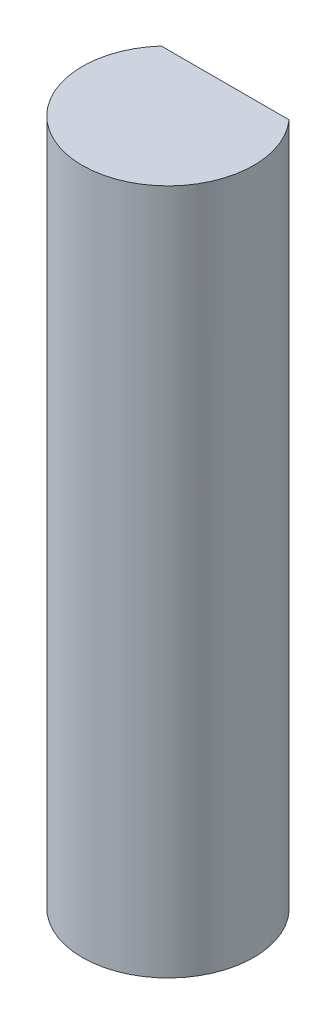
ISO-10303-21;
HEADER;
FILE_DESCRIPTION(('STEP AP214'),'2;1');
FILE_NAME('part.step','',(''),(''),'','','');
FILE_SCHEMA(('AUTOMOTIVE_DESIGN { 1 0 10303 214 1 1 1 1 }'));
ENDSEC;
DATA;
#1=APPLICATION_CONTEXT('core data for automotive mechanical design processes');
#2=APPLICATION_PROTOCOL_DEFINITION('international standard','automotive_design',2000,#1);
#3=PRODUCT_CONTEXT('',#1,'mechanical');
#4=PRODUCT('Part','Part','',(#3));
#5=PRODUCT_RELATED_PRODUCT_CATEGORY('part','',(#4));
#6=PRODUCT_DEFINITION_FORMATION('','',#4);
#7=PRODUCT_DEFINITION_CONTEXT('part definition',#1,'design');
#8=PRODUCT_DEFINITION('design','',#6,#7);
#9=PRODUCT_DEFINITION_SHAPE('','',#8);
#10=(LENGTH_UNIT() NAMED_UNIT(*) SI_UNIT(.MILLI.,.METRE.));
#11=(NAMED_UNIT(*) PLANE_ANGLE_UNIT() SI_UNIT($,.RADIAN.));
#12=(NAMED_UNIT(*) SI_UNIT($,.STERADIAN.) SOLID_ANGLE_UNIT());
#13=UNCERTAINTY_MEASURE_WITH_UNIT(LENGTH_MEASURE(1.E-05),#10,'distance_accuracy_value','');
#14=(GEOMETRIC_REPRESENTATION_CONTEXT(3) GLOBAL_UNCERTAINTY_ASSIGNED_CONTEXT((#13)) GLOBAL_UNIT_ASSIGNED_CONTEXT((#10,
#11,#12)) REPRESENTATION_CONTEXT('',''));
#15=CARTESIAN_POINT('',(0.,0.,0.));
#16=DIRECTION('',(0.,0.,1.));
#17=DIRECTION('',(1.,0.,0.));
#18=AXIS2_PLACEMENT_3D('',#15,#16,#17);
#19=CARTESIAN_POINT('',(0.,10.,0.));
#20=DIRECTION('',(0.,-1.,0.));
#21=DIRECTION('',(0.,0.,-1.));
#22=AXIS2_PLACEMENT_3D('',#19,#20,#21);
#23=CYLINDRICAL_SURFACE('',#22,1.5);
#24=CARTESIAN_POINT('',(0.,10.,0.));
#25=DIRECTION('',(0.,1.,0.));
#26=DIRECTION('',(0.,0.,1.));
#27=AXIS2_PLACEMENT_3D('',#24,#25,#26);
#28=CIRCLE('',#27,1.5);
#29=CARTESIAN_POINT('',(-1.1180339887499,10.,-1.));
#30=VERTEX_POINT('',#29);
#31=CARTESIAN_POINT('',(1.1180339887499,10.,-1.));
#32=VERTEX_POINT('',#31);
#33=EDGE_CURVE('E11',#30,#32,#28,.T.);
#34=ORIENTED_EDGE('',*,*,#33,.F.);
#35=DIRECTION('',(0.,1.,0.));
#36=VECTOR('',#35,1.);
#37=CARTESIAN_POINT('',(-1.1180339887499,0.,-1.));
#38=LINE('',#37,#36);
#39=CARTESIAN_POINT('',(-1.1180339887499,0.,-1.));
#40=VERTEX_POINT('',#39);
#41=EDGE_CURVE('E66',#40,#30,#38,.T.);
#42=ORIENTED_EDGE('',*,*,#41,.F.);
#43=CARTESIAN_POINT('',(0.,0.,0.));
#44=DIRECTION('',(0.,-1.,0.));
#45=DIRECTION('',(0.,0.,-1.));
#46=AXIS2_PLACEMENT_3D('',#43,#44,#45);
#47=CIRCLE('',#46,1.5);
#48=CARTESIAN_POINT('',(1.1180339887499,0.,-1.));
#49=VERTEX_POINT('',#48);
#50=EDGE_CURVE('E78',#40,#49,#47,.T.);
#51=ORIENTED_EDGE('',*,*,#50,.T.);
#52=DIRECTION('',(0.,1.,0.));
#53=VECTOR('',#52,1.);
#54=CARTESIAN_POINT('',(1.1180339887499,0.,-1.));
#55=LINE('',#54,#53);
#56=EDGE_CURVE('E52',#49,#32,#55,.T.);
#57=ORIENTED_EDGE('',*,*,#56,.T.);
#58=EDGE_LOOP('',(#34,#42,#51,#57));
#59=FACE_BOUND('',#58,.T.);
#60=CARTESIAN_POINT('',(0.,-2.,0.));
#61=DIRECTION('',(0.,-1.,0.));
#62=DIRECTION('',(0.,0.,-1.));
#63=AXIS2_PLACEMENT_3D('',#60,#61,#62);
#64=CIRCLE('',#63,1.5);
#65=CARTESIAN_POINT('',(0.,-2.,-1.5));
#66=VERTEX_POINT('',#65);
#67=EDGE_CURVE('E81',#66,#66,#64,.T.);
#68=ORIENTED_EDGE('',*,*,#67,.F.);
#69=EDGE_LOOP('',(#68));
#70=FACE_BOUND('',#69,.T.);
#71=ADVANCED_FACE('F43',(#59,#70),#23,.T.);
#72=CARTESIAN_POINT('',(0.,10.,0.));
#73=DIRECTION('',(0.,1.,0.));
#74=DIRECTION('',(0.,0.,1.));
#75=AXIS2_PLACEMENT_3D('',#72,#73,#74);
#76=PLANE('',#75);
#77=DIRECTION('',(1.,0.,0.));
#78=VECTOR('',#77,1.);
#79=CARTESIAN_POINT('',(-1.1180339887499,10.,-1.));
#80=LINE('',#79,#78);
#81=EDGE_CURVE('E70',#30,#32,#80,.T.);
#82=ORIENTED_EDGE('',*,*,#81,.F.);
#83=ORIENTED_EDGE('',*,*,#33,.T.);
#84=EDGE_LOOP('',(#82,#83));
#85=FACE_BOUND('',#84,.T.);
#86=ADVANCED_FACE('F96',(#85),#76,.T.);
#87=CARTESIAN_POINT('',(-1.1180339887499,0.,-1.));
#88=DIRECTION('',(0.,0.,1.));
#89=DIRECTION('',(1.,0.,0.));
#90=AXIS2_PLACEMENT_3D('',#87,#88,#89);
#91=PLANE('',#90);
#92=ORIENTED_EDGE('',*,*,#81,.T.);
#93=ORIENTED_EDGE('',*,*,#56,.F.);
#94=DIRECTION('',(1.,0.,0.));
#95=VECTOR('',#94,1.);
#96=CARTESIAN_POINT('',(-1.1180339887499,0.,-1.));
#97=LINE('',#96,#95);
#98=EDGE_CURVE('E60',#40,#49,#97,.T.);
#99=ORIENTED_EDGE('',*,*,#98,.F.);
#100=ORIENTED_EDGE('',*,*,#41,.T.);
#101=EDGE_LOOP('',(#92,#93,#99,#100));
#102=FACE_BOUND('',#101,.T.);
#103=ADVANCED_FACE('F69',(#102),#91,.F.);
#104=CARTESIAN_POINT('',(0.,0.,0.));
#105=DIRECTION('',(0.,-1.,0.));
#106=DIRECTION('',(0.,0.,-1.));
#107=AXIS2_PLACEMENT_3D('',#104,#105,#106);
#108=PLANE('',#107);
#109=ORIENTED_EDGE('',*,*,#50,.F.);
#110=ORIENTED_EDGE('',*,*,#98,.T.);
#111=EDGE_LOOP('',(#109,#110));
#112=FACE_BOUND('',#111,.T.);
#113=ADVANCED_FACE('F77',(#112),#108,.F.);
#114=CARTESIAN_POINT('',(0.,-2.,0.));
#115=DIRECTION('',(0.,-1.,0.));
#116=DIRECTION('',(0.,0.,-1.));
#117=AXIS2_PLACEMENT_3D('',#114,#115,#116);
#118=PLANE('',#117);
#119=ORIENTED_EDGE('',*,*,#67,.T.);
#120=EDGE_LOOP('',(#119));
#121=FACE_BOUND('',#120,.T.);
#122=ADVANCED_FACE('F94',(#121),#118,.T.);
#123=CLOSED_SHELL('',(#71,#86,#103,#113,#122));
#124=MANIFOLD_SOLID_BREP('B2',#123);
#125=ADVANCED_BREP_SHAPE_REPRESENTATION('',(#18,#124),#14);
#126=SHAPE_DEFINITION_REPRESENTATION(#9,#125);
ENDSEC;
END-ISO-10303-21;
